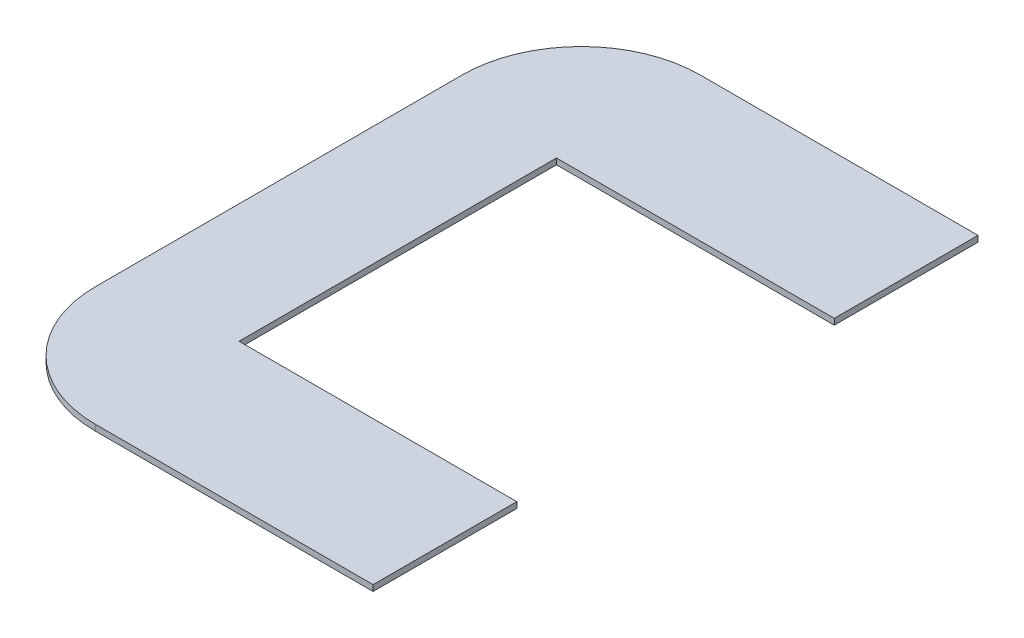
ISO-10303-21;
HEADER;
FILE_DESCRIPTION(('STEP AP214'),'2;1');
FILE_NAME('part.step','',(''),(''),'','','');
FILE_SCHEMA(('AUTOMOTIVE_DESIGN { 1 0 10303 214 1 1 1 1 }'));
ENDSEC;
DATA;
#1=APPLICATION_CONTEXT('core data for automotive mechanical design processes');
#2=APPLICATION_PROTOCOL_DEFINITION('international standard','automotive_design',2000,#1);
#3=PRODUCT_CONTEXT('',#1,'mechanical');
#4=PRODUCT('Part','Part','',(#3));
#5=PRODUCT_RELATED_PRODUCT_CATEGORY('part','',(#4));
#6=PRODUCT_DEFINITION_FORMATION('','',#4);
#7=PRODUCT_DEFINITION_CONTEXT('part definition',#1,'design');
#8=PRODUCT_DEFINITION('design','',#6,#7);
#9=PRODUCT_DEFINITION_SHAPE('','',#8);
#10=(LENGTH_UNIT() NAMED_UNIT(*) SI_UNIT(.MILLI.,.METRE.));
#11=(NAMED_UNIT(*) PLANE_ANGLE_UNIT() SI_UNIT($,.RADIAN.));
#12=(NAMED_UNIT(*) SI_UNIT($,.STERADIAN.) SOLID_ANGLE_UNIT());
#13=UNCERTAINTY_MEASURE_WITH_UNIT(LENGTH_MEASURE(1.E-05),#10,'distance_accuracy_value','');
#14=(GEOMETRIC_REPRESENTATION_CONTEXT(3) GLOBAL_UNCERTAINTY_ASSIGNED_CONTEXT((#13)) GLOBAL_UNIT_ASSIGNED_CONTEXT((#10,
#11,#12)) REPRESENTATION_CONTEXT('',''));
#15=CARTESIAN_POINT('',(0.,0.,0.));
#16=DIRECTION('',(0.,0.,1.));
#17=DIRECTION('',(1.,0.,0.));
#18=AXIS2_PLACEMENT_3D('',#15,#16,#17);
#19=CARTESIAN_POINT('',(0.,3.,0.));
#20=DIRECTION('',(-1.,0.,0.));
#21=DIRECTION('',(0.,0.,1.));
#22=AXIS2_PLACEMENT_3D('',#19,#20,#21);
#23=PLANE('',#22);
#24=DIRECTION('',(0.,0.,-1.));
#25=VECTOR('',#24,1.);
#26=CARTESIAN_POINT('',(0.,0.,0.));
#27=LINE('',#26,#25);
#28=CARTESIAN_POINT('',(0.,0.,152.44));
#29=VERTEX_POINT('',#28);
#30=CARTESIAN_POINT('',(0.,0.,80.));
#31=VERTEX_POINT('',#30);
#32=EDGE_CURVE('E153',#29,#31,#27,.T.);
#33=ORIENTED_EDGE('',*,*,#32,.T.);
#34=DIRECTION('',(0.,1.,0.));
#35=VECTOR('',#34,1.);
#36=CARTESIAN_POINT('',(0.,-7.,80.));
#37=LINE('',#36,#35);
#38=CARTESIAN_POINT('',(0.,3.,80.));
#39=VERTEX_POINT('',#38);
#40=EDGE_CURVE('E202',#31,#39,#37,.T.);
#41=ORIENTED_EDGE('',*,*,#40,.T.);
#42=DIRECTION('',(0.,0.,-1.));
#43=VECTOR('',#42,1.);
#44=CARTESIAN_POINT('',(0.,3.,0.));
#45=LINE('',#44,#43);
#46=CARTESIAN_POINT('',(0.,3.,152.44));
#47=VERTEX_POINT('',#46);
#48=EDGE_CURVE('E148',#47,#39,#45,.T.);
#49=ORIENTED_EDGE('',*,*,#48,.F.);
#50=DIRECTION('',(0.,1.,0.));
#51=VECTOR('',#50,1.);
#52=CARTESIAN_POINT('',(0.,-7.,152.44));
#53=LINE('',#52,#51);
#54=EDGE_CURVE('E199',#29,#47,#53,.T.);
#55=ORIENTED_EDGE('',*,*,#54,.F.);
#56=EDGE_LOOP('',(#33,#41,#49,#55));
#57=FACE_BOUND('',#56,.T.);
#58=ADVANCED_FACE('F41',(#57),#23,.F.);
#59=CARTESIAN_POINT('',(0.,3.,-80.));
#60=VERTEX_POINT('',#59);
#61=CARTESIAN_POINT('',(0.,3.,-152.44));
#62=VERTEX_POINT('',#61);
#63=EDGE_CURVE('E139',#60,#62,#45,.T.);
#64=ORIENTED_EDGE('',*,*,#63,.F.);
#65=DIRECTION('',(0.,1.,0.));
#66=VECTOR('',#65,1.);
#67=CARTESIAN_POINT('',(0.,-7.,-80.));
#68=LINE('',#67,#66);
#69=CARTESIAN_POINT('',(0.,0.,-80.));
#70=VERTEX_POINT('',#69);
#71=EDGE_CURVE('E120',#70,#60,#68,.T.);
#72=ORIENTED_EDGE('',*,*,#71,.F.);
#73=CARTESIAN_POINT('',(0.,0.,-152.44));
#74=VERTEX_POINT('',#73);
#75=EDGE_CURVE('E163',#70,#74,#27,.T.);
#76=ORIENTED_EDGE('',*,*,#75,.T.);
#77=DIRECTION('',(0.,1.,0.));
#78=VECTOR('',#77,1.);
#79=CARTESIAN_POINT('',(0.,-7.,-152.44));
#80=LINE('',#79,#78);
#81=EDGE_CURVE('E147',#74,#62,#80,.T.);
#82=ORIENTED_EDGE('',*,*,#81,.T.);
#83=EDGE_LOOP('',(#64,#72,#76,#82));
#84=FACE_BOUND('',#83,.T.);
#85=ADVANCED_FACE('F145',(#84),#23,.F.);
#86=CARTESIAN_POINT('',(-200.,3.,0.));
#87=DIRECTION('',(-1.,0.,0.));
#88=DIRECTION('',(0.,0.,1.));
#89=AXIS2_PLACEMENT_3D('',#86,#87,#88);
#90=PLANE('',#89);
#91=DIRECTION('',(0.,0.,-1.));
#92=VECTOR('',#91,1.);
#93=CARTESIAN_POINT('',(-200.,0.,0.));
#94=LINE('',#93,#92);
#95=CARTESIAN_POINT('',(-200.,0.,92.44));
#96=VERTEX_POINT('',#95);
#97=CARTESIAN_POINT('',(-200.,0.,-92.44));
#98=VERTEX_POINT('',#97);
#99=EDGE_CURVE('E149',#96,#98,#94,.T.);
#100=ORIENTED_EDGE('',*,*,#99,.F.);
#101=DIRECTION('',(0.,1.,0.));
#102=VECTOR('',#101,1.);
#103=CARTESIAN_POINT('',(-200.,3.,92.44));
#104=LINE('',#103,#102);
#105=CARTESIAN_POINT('',(-200.,3.,92.44));
#106=VERTEX_POINT('',#105);
#107=EDGE_CURVE('E177',#96,#106,#104,.T.);
#108=ORIENTED_EDGE('',*,*,#107,.T.);
#109=DIRECTION('',(0.,0.,-1.));
#110=VECTOR('',#109,1.);
#111=CARTESIAN_POINT('',(-200.,3.,0.));
#112=LINE('',#111,#110);
#113=CARTESIAN_POINT('',(-200.,3.,-92.44));
#114=VERTEX_POINT('',#113);
#115=EDGE_CURVE('E152',#106,#114,#112,.T.);
#116=ORIENTED_EDGE('',*,*,#115,.T.);
#117=DIRECTION('',(0.,1.,0.));
#118=VECTOR('',#117,1.);
#119=CARTESIAN_POINT('',(-200.,0.,-92.44));
#120=LINE('',#119,#118);
#121=EDGE_CURVE('E175',#114,#98,#120,.F.);
#122=ORIENTED_EDGE('',*,*,#121,.T.);
#123=EDGE_LOOP('',(#100,#108,#116,#122));
#124=FACE_BOUND('',#123,.T.);
#125=ADVANCED_FACE('F192',(#124),#90,.T.);
#126=CARTESIAN_POINT('',(0.,3.,0.));
#127=DIRECTION('',(0.,1.,0.));
#128=DIRECTION('',(0.,0.,1.));
#129=AXIS2_PLACEMENT_3D('',#126,#127,#128);
#130=PLANE('',#129);
#131=ORIENTED_EDGE('',*,*,#115,.F.);
#132=CARTESIAN_POINT('',(-140.,3.,92.44));
#133=DIRECTION('',(0.,1.,0.));
#134=DIRECTION('',(0.,0.,1.));
#135=AXIS2_PLACEMENT_3D('',#132,#133,#134);
#136=CIRCLE('',#135,60.);
#137=CARTESIAN_POINT('',(-140.,3.,152.44));
#138=VERTEX_POINT('',#137);
#139=EDGE_CURVE('E182',#106,#138,#136,.T.);
#140=ORIENTED_EDGE('',*,*,#139,.T.);
#141=DIRECTION('',(-1.,0.,0.));
#142=VECTOR('',#141,1.);
#143=CARTESIAN_POINT('',(-200.,3.,152.44));
#144=LINE('',#143,#142);
#145=EDGE_CURVE('E157',#47,#138,#144,.T.);
#146=ORIENTED_EDGE('',*,*,#145,.F.);
#147=ORIENTED_EDGE('',*,*,#48,.T.);
#148=DIRECTION('',(1.,0.,0.));
#149=VECTOR('',#148,1.);
#150=CARTESIAN_POINT('',(-140.,3.,80.));
#151=LINE('',#150,#149);
#152=CARTESIAN_POINT('',(-140.,3.,80.));
#153=VERTEX_POINT('',#152);
#154=EDGE_CURVE('E132',#153,#39,#151,.T.);
#155=ORIENTED_EDGE('',*,*,#154,.F.);
#156=DIRECTION('',(0.,0.,1.));
#157=VECTOR('',#156,1.);
#158=CARTESIAN_POINT('',(-140.,3.,-80.));
#159=LINE('',#158,#157);
#160=CARTESIAN_POINT('',(-140.,3.,-80.));
#161=VERTEX_POINT('',#160);
#162=EDGE_CURVE('E143',#161,#153,#159,.T.);
#163=ORIENTED_EDGE('',*,*,#162,.F.);
#164=DIRECTION('',(-1.,0.,0.));
#165=VECTOR('',#164,1.);
#166=CARTESIAN_POINT('',(-140.,3.,-80.));
#167=LINE('',#166,#165);
#168=EDGE_CURVE('E123',#60,#161,#167,.T.);
#169=ORIENTED_EDGE('',*,*,#168,.F.);
#170=ORIENTED_EDGE('',*,*,#63,.T.);
#171=DIRECTION('',(1.,0.,0.));
#172=VECTOR('',#171,1.);
#173=CARTESIAN_POINT('',(-200.,3.,-152.44));
#174=LINE('',#173,#172);
#175=CARTESIAN_POINT('',(-140.,3.,-152.44));
#176=VERTEX_POINT('',#175);
#177=EDGE_CURVE('E200',#176,#62,#174,.T.);
#178=ORIENTED_EDGE('',*,*,#177,.F.);
#179=CARTESIAN_POINT('',(-140.,3.,-92.44));
#180=DIRECTION('',(0.,1.,0.));
#181=DIRECTION('',(0.,0.,1.));
#182=AXIS2_PLACEMENT_3D('',#179,#180,#181);
#183=CIRCLE('',#182,60.);
#184=EDGE_CURVE('E180',#176,#114,#183,.T.);
#185=ORIENTED_EDGE('',*,*,#184,.T.);
#186=EDGE_LOOP('',(#131,#140,#146,#147,#155,#163,#169,#170,#178,#185));
#187=FACE_BOUND('',#186,.T.);
#188=ADVANCED_FACE('F137',(#187),#130,.T.);
#189=CARTESIAN_POINT('',(0.,0.,0.));
#190=DIRECTION('',(0.,1.,0.));
#191=DIRECTION('',(0.,0.,1.));
#192=AXIS2_PLACEMENT_3D('',#189,#190,#191);
#193=PLANE('',#192);
#194=DIRECTION('',(-1.,0.,0.));
#195=VECTOR('',#194,1.);
#196=CARTESIAN_POINT('',(0.,0.,152.44));
#197=LINE('',#196,#195);
#198=CARTESIAN_POINT('',(-140.,0.,152.44));
#199=VERTEX_POINT('',#198);
#200=EDGE_CURVE('E161',#29,#199,#197,.T.);
#201=ORIENTED_EDGE('',*,*,#200,.T.);
#202=CARTESIAN_POINT('',(-140.,0.,92.44));
#203=DIRECTION('',(0.,1.,0.));
#204=DIRECTION('',(0.,0.,1.));
#205=AXIS2_PLACEMENT_3D('',#202,#203,#204);
#206=CIRCLE('',#205,60.);
#207=EDGE_CURVE('E49',#199,#96,#206,.F.);
#208=ORIENTED_EDGE('',*,*,#207,.T.);
#209=ORIENTED_EDGE('',*,*,#99,.T.);
#210=CARTESIAN_POINT('',(-140.,0.,-92.44));
#211=DIRECTION('',(0.,1.,0.));
#212=DIRECTION('',(0.,0.,1.));
#213=AXIS2_PLACEMENT_3D('',#210,#211,#212);
#214=CIRCLE('',#213,60.);
#215=CARTESIAN_POINT('',(-140.,0.,-152.44));
#216=VERTEX_POINT('',#215);
#217=EDGE_CURVE('E56',#98,#216,#214,.F.);
#218=ORIENTED_EDGE('',*,*,#217,.T.);
#219=DIRECTION('',(1.,0.,0.));
#220=VECTOR('',#219,1.);
#221=CARTESIAN_POINT('',(0.,0.,-152.44));
#222=LINE('',#221,#220);
#223=EDGE_CURVE('E166',#216,#74,#222,.T.);
#224=ORIENTED_EDGE('',*,*,#223,.T.);
#225=ORIENTED_EDGE('',*,*,#75,.F.);
#226=DIRECTION('',(-1.,0.,0.));
#227=VECTOR('',#226,1.);
#228=CARTESIAN_POINT('',(0.,0.,-80.));
#229=LINE('',#228,#227);
#230=CARTESIAN_POINT('',(-140.,0.,-80.));
#231=VERTEX_POINT('',#230);
#232=EDGE_CURVE('E126',#70,#231,#229,.T.);
#233=ORIENTED_EDGE('',*,*,#232,.T.);
#234=DIRECTION('',(0.,0.,1.));
#235=VECTOR('',#234,1.);
#236=CARTESIAN_POINT('',(-140.,0.,0.));
#237=LINE('',#236,#235);
#238=CARTESIAN_POINT('',(-140.,0.,80.));
#239=VERTEX_POINT('',#238);
#240=EDGE_CURVE('E169',#231,#239,#237,.T.);
#241=ORIENTED_EDGE('',*,*,#240,.T.);
#242=DIRECTION('',(1.,0.,0.));
#243=VECTOR('',#242,1.);
#244=CARTESIAN_POINT('',(0.,0.,80.));
#245=LINE('',#244,#243);
#246=EDGE_CURVE('E172',#239,#31,#245,.T.);
#247=ORIENTED_EDGE('',*,*,#246,.T.);
#248=ORIENTED_EDGE('',*,*,#32,.F.);
#249=EDGE_LOOP('',(#201,#208,#209,#218,#224,#225,#233,#241,#247,#248));
#250=FACE_BOUND('',#249,.T.);
#251=ADVANCED_FACE('F187',(#250),#193,.F.);
#252=CARTESIAN_POINT('',(-200.,-7.,152.44));
#253=DIRECTION('',(0.,0.,-1.));
#254=DIRECTION('',(-1.,0.,0.));
#255=AXIS2_PLACEMENT_3D('',#252,#253,#254);
#256=PLANE('',#255);
#257=ORIENTED_EDGE('',*,*,#145,.T.);
#258=DIRECTION('',(0.,1.,0.));
#259=VECTOR('',#258,1.);
#260=CARTESIAN_POINT('',(-140.,0.,152.44));
#261=LINE('',#260,#259);
#262=EDGE_CURVE('E64',#138,#199,#261,.F.);
#263=ORIENTED_EDGE('',*,*,#262,.T.);
#264=ORIENTED_EDGE('',*,*,#200,.F.);
#265=ORIENTED_EDGE('',*,*,#54,.T.);
#266=EDGE_LOOP('',(#257,#263,#264,#265));
#267=FACE_BOUND('',#266,.T.);
#268=ADVANCED_FACE('F197',(#267),#256,.F.);
#269=CARTESIAN_POINT('',(-200.,-7.,-152.44));
#270=DIRECTION('',(0.,0.,1.));
#271=DIRECTION('',(1.,0.,0.));
#272=AXIS2_PLACEMENT_3D('',#269,#270,#271);
#273=PLANE('',#272);
#274=ORIENTED_EDGE('',*,*,#223,.F.);
#275=DIRECTION('',(0.,1.,0.));
#276=VECTOR('',#275,1.);
#277=CARTESIAN_POINT('',(-140.,3.,-152.44));
#278=LINE('',#277,#276);
#279=EDGE_CURVE('E11',#216,#176,#278,.T.);
#280=ORIENTED_EDGE('',*,*,#279,.T.);
#281=ORIENTED_EDGE('',*,*,#177,.T.);
#282=ORIENTED_EDGE('',*,*,#81,.F.);
#283=EDGE_LOOP('',(#274,#280,#281,#282));
#284=FACE_BOUND('',#283,.T.);
#285=ADVANCED_FACE('F219',(#284),#273,.F.);
#286=CARTESIAN_POINT('',(-140.,-7.,80.));
#287=DIRECTION('',(0.,0.,1.));
#288=DIRECTION('',(1.,0.,0.));
#289=AXIS2_PLACEMENT_3D('',#286,#287,#288);
#290=PLANE('',#289);
#291=DIRECTION('',(0.,1.,0.));
#292=VECTOR('',#291,1.);
#293=CARTESIAN_POINT('',(-140.,-7.,80.));
#294=LINE('',#293,#292);
#295=EDGE_CURVE('E204',#239,#153,#294,.T.);
#296=ORIENTED_EDGE('',*,*,#295,.T.);
#297=ORIENTED_EDGE('',*,*,#154,.T.);
#298=ORIENTED_EDGE('',*,*,#40,.F.);
#299=ORIENTED_EDGE('',*,*,#246,.F.);
#300=EDGE_LOOP('',(#296,#297,#298,#299));
#301=FACE_BOUND('',#300,.T.);
#302=ADVANCED_FACE('F216',(#301),#290,.F.);
#303=CARTESIAN_POINT('',(-140.,-7.,-80.));
#304=DIRECTION('',(-1.,0.,0.));
#305=DIRECTION('',(0.,0.,1.));
#306=AXIS2_PLACEMENT_3D('',#303,#304,#305);
#307=PLANE('',#306);
#308=DIRECTION('',(0.,1.,0.));
#309=VECTOR('',#308,1.);
#310=CARTESIAN_POINT('',(-140.,-7.,-80.));
#311=LINE('',#310,#309);
#312=EDGE_CURVE('E131',#231,#161,#311,.T.);
#313=ORIENTED_EDGE('',*,*,#312,.T.);
#314=ORIENTED_EDGE('',*,*,#162,.T.);
#315=ORIENTED_EDGE('',*,*,#295,.F.);
#316=ORIENTED_EDGE('',*,*,#240,.F.);
#317=EDGE_LOOP('',(#313,#314,#315,#316));
#318=FACE_BOUND('',#317,.T.);
#319=ADVANCED_FACE('F213',(#318),#307,.F.);
#320=CARTESIAN_POINT('',(-140.,-7.,-80.));
#321=DIRECTION('',(0.,0.,-1.));
#322=DIRECTION('',(-1.,0.,0.));
#323=AXIS2_PLACEMENT_3D('',#320,#321,#322);
#324=PLANE('',#323);
#325=ORIENTED_EDGE('',*,*,#71,.T.);
#326=ORIENTED_EDGE('',*,*,#168,.T.);
#327=ORIENTED_EDGE('',*,*,#312,.F.);
#328=ORIENTED_EDGE('',*,*,#232,.F.);
#329=EDGE_LOOP('',(#325,#326,#327,#328));
#330=FACE_BOUND('',#329,.T.);
#331=ADVANCED_FACE('F122',(#330),#324,.F.);
#332=CARTESIAN_POINT('',(-140.,3.,92.44));
#333=DIRECTION('',(0.,-1.,0.));
#334=DIRECTION('',(0.,0.,-1.));
#335=AXIS2_PLACEMENT_3D('',#332,#333,#334);
#336=CYLINDRICAL_SURFACE('',#335,60.);
#337=ORIENTED_EDGE('',*,*,#207,.F.);
#338=ORIENTED_EDGE('',*,*,#262,.F.);
#339=ORIENTED_EDGE('',*,*,#139,.F.);
#340=ORIENTED_EDGE('',*,*,#107,.F.);
#341=EDGE_LOOP('',(#337,#338,#339,#340));
#342=FACE_BOUND('',#341,.T.);
#343=ADVANCED_FACE('F194',(#342),#336,.T.);
#344=CARTESIAN_POINT('',(-140.,-7.,-92.44));
#345=DIRECTION('',(0.,-1.,0.));
#346=DIRECTION('',(0.,0.,-1.));
#347=AXIS2_PLACEMENT_3D('',#344,#345,#346);
#348=CYLINDRICAL_SURFACE('',#347,60.);
#349=ORIENTED_EDGE('',*,*,#217,.F.);
#350=ORIENTED_EDGE('',*,*,#121,.F.);
#351=ORIENTED_EDGE('',*,*,#184,.F.);
#352=ORIENTED_EDGE('',*,*,#279,.F.);
#353=EDGE_LOOP('',(#349,#350,#351,#352));
#354=FACE_BOUND('',#353,.T.);
#355=ADVANCED_FACE('F43',(#354),#348,.T.);
#356=CLOSED_SHELL('',(#58,#85,#125,#188,#251,#268,#285,#302,#319,#331,#343,#355));
#357=MANIFOLD_SOLID_BREP('B2',#356);
#358=ADVANCED_BREP_SHAPE_REPRESENTATION('',(#18,#357),#14);
#359=SHAPE_DEFINITION_REPRESENTATION(#9,#358);
ENDSEC;
END-ISO-10303-21;
